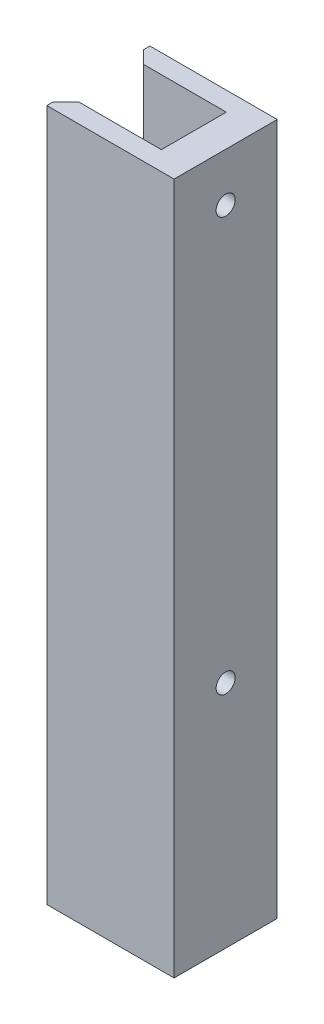
ISO-10303-21;
HEADER;
FILE_DESCRIPTION(('STEP AP214'),'2;1');
FILE_NAME('part.step','',(''),(''),'','','');
FILE_SCHEMA(('AUTOMOTIVE_DESIGN { 1 0 10303 214 1 1 1 1 }'));
ENDSEC;
DATA;
#1=APPLICATION_CONTEXT('core data for automotive mechanical design processes');
#2=APPLICATION_PROTOCOL_DEFINITION('international standard','automotive_design',2000,#1);
#3=PRODUCT_CONTEXT('',#1,'mechanical');
#4=PRODUCT('Part','Part','',(#3));
#5=PRODUCT_RELATED_PRODUCT_CATEGORY('part','',(#4));
#6=PRODUCT_DEFINITION_FORMATION('','',#4);
#7=PRODUCT_DEFINITION_CONTEXT('part definition',#1,'design');
#8=PRODUCT_DEFINITION('design','',#6,#7);
#9=PRODUCT_DEFINITION_SHAPE('','',#8);
#10=(LENGTH_UNIT() NAMED_UNIT(*) SI_UNIT(.MILLI.,.METRE.));
#11=(NAMED_UNIT(*) PLANE_ANGLE_UNIT() SI_UNIT($,.RADIAN.));
#12=(NAMED_UNIT(*) SI_UNIT($,.STERADIAN.) SOLID_ANGLE_UNIT());
#13=UNCERTAINTY_MEASURE_WITH_UNIT(LENGTH_MEASURE(1.E-05),#10,'distance_accuracy_value','');
#14=(GEOMETRIC_REPRESENTATION_CONTEXT(3) GLOBAL_UNCERTAINTY_ASSIGNED_CONTEXT((#13)) GLOBAL_UNIT_ASSIGNED_CONTEXT((#10,
#11,#12)) REPRESENTATION_CONTEXT('',''));
#15=CARTESIAN_POINT('',(0.,0.,0.));
#16=DIRECTION('',(0.,0.,1.));
#17=DIRECTION('',(1.,0.,0.));
#18=AXIS2_PLACEMENT_3D('',#15,#16,#17);
#19=CARTESIAN_POINT('',(2.96518887031091,45.5267276110473,0.));
#20=DIRECTION('',(0.,1.,0.));
#21=DIRECTION('',(0.,0.,1.));
#22=AXIS2_PLACEMENT_3D('',#19,#20,#21);
#23=PLANE('',#22);
#24=DIRECTION('',(0.,0.,-1.));
#25=VECTOR('',#24,1.);
#26=CARTESIAN_POINT('',(-17.0348111296891,45.5267276110473,0.));
#27=LINE('',#26,#25);
#28=CARTESIAN_POINT('',(-17.0348111296891,45.5267276110474,123.9));
#29=VERTEX_POINT('',#28);
#30=CARTESIAN_POINT('',(-17.0348111296891,45.5267276110474,122.9));
#31=VERTEX_POINT('',#30);
#32=EDGE_CURVE('E158',#29,#31,#27,.T.);
#33=ORIENTED_EDGE('',*,*,#32,.F.);
#34=DIRECTION('',(0.707106781186545,0.,0.70710678118655));
#35=VECTOR('',#34,1.);
#36=CARTESIAN_POINT('',(-68.9848111296891,45.5267276110473,71.9499999999995));
#37=LINE('',#36,#35);
#38=CARTESIAN_POINT('',(-15.0348111296891,45.5267276110474,125.9));
#39=VERTEX_POINT('',#38);
#40=EDGE_CURVE('E210',#29,#39,#37,.T.);
#41=ORIENTED_EDGE('',*,*,#40,.T.);
#42=DIRECTION('',(1.,0.,0.));
#43=VECTOR('',#42,1.);
#44=CARTESIAN_POINT('',(0.,45.5267276110474,125.9));
#45=LINE('',#44,#43);
#46=CARTESIAN_POINT('',(-2.03481112968909,45.5267276110474,125.9));
#47=VERTEX_POINT('',#46);
#48=EDGE_CURVE('E151',#39,#47,#45,.T.);
#49=ORIENTED_EDGE('',*,*,#48,.T.);
#50=DIRECTION('',(0.,0.,-1.));
#51=VECTOR('',#50,1.);
#52=CARTESIAN_POINT('',(-2.03481112968909,45.5267276110473,0.));
#53=LINE('',#52,#51);
#54=CARTESIAN_POINT('',(-2.03481112968909,45.5267276110474,136.1));
#55=VERTEX_POINT('',#54);
#56=EDGE_CURVE('E168',#55,#47,#53,.T.);
#57=ORIENTED_EDGE('',*,*,#56,.F.);
#58=DIRECTION('',(-1.,0.,0.));
#59=VECTOR('',#58,1.);
#60=CARTESIAN_POINT('',(0.,45.5267276110474,136.1));
#61=LINE('',#60,#59);
#62=CARTESIAN_POINT('',(-15.0348111296891,45.5267276110474,136.1));
#63=VERTEX_POINT('',#62);
#64=EDGE_CURVE('E169',#55,#63,#61,.T.);
#65=ORIENTED_EDGE('',*,*,#64,.T.);
#66=DIRECTION('',(-0.707106781186543,0.,0.707106781186552));
#67=VECTOR('',#66,1.);
#68=CARTESIAN_POINT('',(62.0151888703108,45.5267276110473,59.0499999999991));
#69=LINE('',#68,#67);
#70=CARTESIAN_POINT('',(-17.0348111296891,45.5267276110474,138.1));
#71=VERTEX_POINT('',#70);
#72=EDGE_CURVE('E57',#63,#71,#69,.T.);
#73=ORIENTED_EDGE('',*,*,#72,.T.);
#74=DIRECTION('',(0.,0.,-1.));
#75=VECTOR('',#74,1.);
#76=CARTESIAN_POINT('',(-17.0348111296891,45.5267276110473,0.));
#77=LINE('',#76,#75);
#78=CARTESIAN_POINT('',(-17.0348111296891,45.5267276110474,139.1));
#79=VERTEX_POINT('',#78);
#80=EDGE_CURVE('E129',#79,#71,#77,.T.);
#81=ORIENTED_EDGE('',*,*,#80,.F.);
#82=DIRECTION('',(1.,0.,0.));
#83=VECTOR('',#82,1.);
#84=CARTESIAN_POINT('',(0.,45.5267276110474,139.1));
#85=LINE('',#84,#83);
#86=CARTESIAN_POINT('',(2.96518887031091,45.5267276110474,139.1));
#87=VERTEX_POINT('',#86);
#88=EDGE_CURVE('E126',#79,#87,#85,.T.);
#89=ORIENTED_EDGE('',*,*,#88,.T.);
#90=DIRECTION('',(0.,0.,-1.));
#91=VECTOR('',#90,1.);
#92=CARTESIAN_POINT('',(2.96518887031091,45.5267276110473,0.));
#93=LINE('',#92,#91);
#94=CARTESIAN_POINT('',(2.96518887031091,45.5267276110474,122.9));
#95=VERTEX_POINT('',#94);
#96=EDGE_CURVE('E173',#87,#95,#93,.T.);
#97=ORIENTED_EDGE('',*,*,#96,.T.);
#98=DIRECTION('',(1.,0.,0.));
#99=VECTOR('',#98,1.);
#100=CARTESIAN_POINT('',(0.,45.5267276110474,122.9));
#101=LINE('',#100,#99);
#102=EDGE_CURVE('E161',#31,#95,#101,.T.);
#103=ORIENTED_EDGE('',*,*,#102,.F.);
#104=EDGE_LOOP('',(#33,#41,#49,#57,#65,#73,#81,#89,#97,#103));
#105=FACE_BOUND('',#104,.T.);
#106=ADVANCED_FACE('F41',(#105),#23,.T.);
#107=CARTESIAN_POINT('',(2.96518887031091,-27.0732723889526,131.));
#108=DIRECTION('',(-1.,0.,0.));
#109=DIRECTION('',(0.,0.,1.));
#110=AXIS2_PLACEMENT_3D('',#107,#108,#109);
#111=CYLINDRICAL_SURFACE('',#110,1.5);
#112=CARTESIAN_POINT('',(2.96518887031091,-27.0732723889526,131.));
#113=DIRECTION('',(1.,0.,0.));
#114=DIRECTION('',(0.,0.,-1.));
#115=AXIS2_PLACEMENT_3D('',#112,#113,#114);
#116=CIRCLE('',#115,1.5);
#117=CARTESIAN_POINT('',(2.96518887031091,-27.0732723889526,129.5));
#118=VERTEX_POINT('',#117);
#119=EDGE_CURVE('E175',#118,#118,#116,.T.);
#120=ORIENTED_EDGE('',*,*,#119,.T.);
#121=EDGE_LOOP('',(#120));
#122=FACE_BOUND('',#121,.T.);
#123=CARTESIAN_POINT('',(-2.03481112968909,-27.0732723889526,131.));
#124=DIRECTION('',(1.,0.,0.));
#125=DIRECTION('',(0.,0.,-1.));
#126=AXIS2_PLACEMENT_3D('',#123,#124,#125);
#127=CIRCLE('',#126,1.5);
#128=CARTESIAN_POINT('',(-2.03481112968909,-27.0732723889526,129.5));
#129=VERTEX_POINT('',#128);
#130=EDGE_CURVE('E194',#129,#129,#127,.T.);
#131=ORIENTED_EDGE('',*,*,#130,.F.);
#132=EDGE_LOOP('',(#131));
#133=FACE_BOUND('',#132,.T.);
#134=ADVANCED_FACE('F240',(#122,#133),#111,.F.);
#135=CARTESIAN_POINT('',(2.96518887031091,37.9267276110474,131.));
#136=DIRECTION('',(-1.,0.,0.));
#137=DIRECTION('',(0.,0.,1.));
#138=AXIS2_PLACEMENT_3D('',#135,#136,#137);
#139=CYLINDRICAL_SURFACE('',#138,1.5);
#140=CARTESIAN_POINT('',(2.96518887031091,37.9267276110474,131.));
#141=DIRECTION('',(1.,0.,0.));
#142=DIRECTION('',(0.,0.,-1.));
#143=AXIS2_PLACEMENT_3D('',#140,#141,#142);
#144=CIRCLE('',#143,1.5);
#145=CARTESIAN_POINT('',(2.96518887031091,37.9267276110474,129.5));
#146=VERTEX_POINT('',#145);
#147=EDGE_CURVE('E179',#146,#146,#144,.T.);
#148=ORIENTED_EDGE('',*,*,#147,.T.);
#149=EDGE_LOOP('',(#148));
#150=FACE_BOUND('',#149,.T.);
#151=CARTESIAN_POINT('',(-2.03481112968909,37.9267276110474,131.));
#152=DIRECTION('',(1.,0.,0.));
#153=DIRECTION('',(0.,0.,-1.));
#154=AXIS2_PLACEMENT_3D('',#151,#152,#153);
#155=CIRCLE('',#154,1.5);
#156=CARTESIAN_POINT('',(-2.03481112968909,37.9267276110474,129.5));
#157=VERTEX_POINT('',#156);
#158=EDGE_CURVE('E176',#157,#157,#155,.T.);
#159=ORIENTED_EDGE('',*,*,#158,.F.);
#160=EDGE_LOOP('',(#159));
#161=FACE_BOUND('',#160,.T.);
#162=ADVANCED_FACE('F247',(#150,#161),#139,.F.);
#163=CARTESIAN_POINT('',(2.96518887031091,0.,0.));
#164=DIRECTION('',(1.,0.,0.));
#165=DIRECTION('',(0.,0.,-1.));
#166=AXIS2_PLACEMENT_3D('',#163,#164,#165);
#167=PLANE('',#166);
#168=ORIENTED_EDGE('',*,*,#96,.F.);
#169=DIRECTION('',(0.,-1.,0.));
#170=VECTOR('',#169,1.);
#171=CARTESIAN_POINT('',(2.96518887031091,65.7504760272041,139.1));
#172=LINE('',#171,#170);
#173=CARTESIAN_POINT('',(2.96518887031091,-63.1732723889526,139.1));
#174=VERTEX_POINT('',#173);
#175=EDGE_CURVE('E128',#87,#174,#172,.T.);
#176=ORIENTED_EDGE('',*,*,#175,.T.);
#177=DIRECTION('',(0.,0.,1.));
#178=VECTOR('',#177,1.);
#179=CARTESIAN_POINT('',(2.96518887031091,-63.1732723889527,0.));
#180=LINE('',#179,#178);
#181=CARTESIAN_POINT('',(2.96518887031091,-63.1732723889527,122.9));
#182=VERTEX_POINT('',#181);
#183=EDGE_CURVE('E144',#182,#174,#180,.T.);
#184=ORIENTED_EDGE('',*,*,#183,.F.);
#185=DIRECTION('',(0.,-1.,0.));
#186=VECTOR('',#185,1.);
#187=CARTESIAN_POINT('',(2.96518887031091,65.750476027204,122.9));
#188=LINE('',#187,#186);
#189=EDGE_CURVE('E157',#95,#182,#188,.T.);
#190=ORIENTED_EDGE('',*,*,#189,.F.);
#191=EDGE_LOOP('',(#168,#176,#184,#190));
#192=FACE_BOUND('',#191,.T.);
#193=ORIENTED_EDGE('',*,*,#119,.F.);
#194=EDGE_LOOP('',(#193));
#195=FACE_BOUND('',#194,.T.);
#196=ORIENTED_EDGE('',*,*,#147,.F.);
#197=EDGE_LOOP('',(#196));
#198=FACE_BOUND('',#197,.T.);
#199=ADVANCED_FACE('F257',(#192,#195,#198),#167,.T.);
#200=CARTESIAN_POINT('',(-2.03481112968909,0.,0.));
#201=DIRECTION('',(1.,0.,0.));
#202=DIRECTION('',(0.,0.,-1.));
#203=AXIS2_PLACEMENT_3D('',#200,#201,#202);
#204=PLANE('',#203);
#205=ORIENTED_EDGE('',*,*,#56,.T.);
#206=DIRECTION('',(0.,1.,0.));
#207=VECTOR('',#206,1.);
#208=CARTESIAN_POINT('',(-2.03481112968909,0.,125.9));
#209=LINE('',#208,#207);
#210=CARTESIAN_POINT('',(-2.03481112968909,-60.1732723889526,125.9));
#211=VERTEX_POINT('',#210);
#212=EDGE_CURVE('E191',#211,#47,#209,.T.);
#213=ORIENTED_EDGE('',*,*,#212,.F.);
#214=DIRECTION('',(0.,0.,-1.));
#215=VECTOR('',#214,1.);
#216=CARTESIAN_POINT('',(-2.03481112968909,-60.1732723889527,0.));
#217=LINE('',#216,#215);
#218=CARTESIAN_POINT('',(-2.03481112968909,-60.1732723889526,136.1));
#219=VERTEX_POINT('',#218);
#220=EDGE_CURVE('E188',#219,#211,#217,.T.);
#221=ORIENTED_EDGE('',*,*,#220,.F.);
#222=DIRECTION('',(0.,-1.,0.));
#223=VECTOR('',#222,1.);
#224=CARTESIAN_POINT('',(-2.03481112968909,0.,136.1));
#225=LINE('',#224,#223);
#226=EDGE_CURVE('E185',#55,#219,#225,.T.);
#227=ORIENTED_EDGE('',*,*,#226,.F.);
#228=EDGE_LOOP('',(#205,#213,#221,#227));
#229=FACE_BOUND('',#228,.T.);
#230=ORIENTED_EDGE('',*,*,#130,.T.);
#231=EDGE_LOOP('',(#230));
#232=FACE_BOUND('',#231,.T.);
#233=ORIENTED_EDGE('',*,*,#158,.T.);
#234=EDGE_LOOP('',(#233));
#235=FACE_BOUND('',#234,.T.);
#236=ADVANCED_FACE('F229',(#229,#232,#235),#204,.F.);
#237=CARTESIAN_POINT('',(0.,65.7504760272041,136.1));
#238=DIRECTION('',(0.,0.,1.));
#239=DIRECTION('',(0.,-1.,0.));
#240=AXIS2_PLACEMENT_3D('',#237,#238,#239);
#241=PLANE('',#240);
#242=DIRECTION('',(-1.,0.,0.));
#243=VECTOR('',#242,1.);
#244=CARTESIAN_POINT('',(0.,-60.1732723889526,136.1));
#245=LINE('',#244,#243);
#246=CARTESIAN_POINT('',(-15.0348111296891,-60.1732723889526,136.1));
#247=VERTEX_POINT('',#246);
#248=EDGE_CURVE('E156',#219,#247,#245,.T.);
#249=ORIENTED_EDGE('',*,*,#248,.T.);
#250=DIRECTION('',(0.,1.,0.));
#251=VECTOR('',#250,1.);
#252=CARTESIAN_POINT('',(-15.0348111296891,45.5267276110474,136.1));
#253=LINE('',#252,#251);
#254=EDGE_CURVE('E11',#247,#63,#253,.T.);
#255=ORIENTED_EDGE('',*,*,#254,.T.);
#256=ORIENTED_EDGE('',*,*,#64,.F.);
#257=ORIENTED_EDGE('',*,*,#226,.T.);
#258=EDGE_LOOP('',(#249,#255,#256,#257));
#259=FACE_BOUND('',#258,.T.);
#260=ADVANCED_FACE('F231',(#259),#241,.F.);
#261=CARTESIAN_POINT('',(-17.0348111296891,65.750476027204,0.));
#262=DIRECTION('',(-1.,0.,0.));
#263=DIRECTION('',(0.,0.,1.));
#264=AXIS2_PLACEMENT_3D('',#261,#262,#263);
#265=PLANE('',#264);
#266=ORIENTED_EDGE('',*,*,#80,.T.);
#267=DIRECTION('',(0.,-1.,0.));
#268=VECTOR('',#267,1.);
#269=CARTESIAN_POINT('',(-17.0348111296891,-60.1732723889526,138.1));
#270=LINE('',#269,#268);
#271=CARTESIAN_POINT('',(-17.0348111296891,-60.1732723889526,138.1));
#272=VERTEX_POINT('',#271);
#273=EDGE_CURVE('E50',#71,#272,#270,.T.);
#274=ORIENTED_EDGE('',*,*,#273,.T.);
#275=DIRECTION('',(0.,0.,-1.));
#276=VECTOR('',#275,1.);
#277=CARTESIAN_POINT('',(-17.0348111296891,-60.1732723889527,0.));
#278=LINE('',#277,#276);
#279=CARTESIAN_POINT('',(-17.0348111296891,-60.1732723889526,123.9));
#280=VERTEX_POINT('',#279);
#281=EDGE_CURVE('E145',#272,#280,#278,.T.);
#282=ORIENTED_EDGE('',*,*,#281,.T.);
#283=DIRECTION('',(0.,1.,0.));
#284=VECTOR('',#283,1.);
#285=CARTESIAN_POINT('',(-17.0348111296891,45.5267276110474,123.9));
#286=LINE('',#285,#284);
#287=EDGE_CURVE('E207',#280,#29,#286,.T.);
#288=ORIENTED_EDGE('',*,*,#287,.T.);
#289=ORIENTED_EDGE('',*,*,#32,.T.);
#290=DIRECTION('',(0.,-1.,0.));
#291=VECTOR('',#290,1.);
#292=CARTESIAN_POINT('',(-17.0348111296891,65.750476027204,122.9));
#293=LINE('',#292,#291);
#294=CARTESIAN_POINT('',(-17.0348111296891,-63.1732723889527,122.9));
#295=VERTEX_POINT('',#294);
#296=EDGE_CURVE('E135',#31,#295,#293,.T.);
#297=ORIENTED_EDGE('',*,*,#296,.T.);
#298=DIRECTION('',(0.,0.,-1.));
#299=VECTOR('',#298,1.);
#300=CARTESIAN_POINT('',(-17.0348111296891,-63.1732723889527,0.));
#301=LINE('',#300,#299);
#302=CARTESIAN_POINT('',(-17.0348111296891,-63.1732723889526,139.1));
#303=VERTEX_POINT('',#302);
#304=EDGE_CURVE('E132',#303,#295,#301,.T.);
#305=ORIENTED_EDGE('',*,*,#304,.F.);
#306=DIRECTION('',(0.,-1.,0.));
#307=VECTOR('',#306,1.);
#308=CARTESIAN_POINT('',(-17.0348111296891,65.7504760272041,139.1));
#309=LINE('',#308,#307);
#310=EDGE_CURVE('E119',#79,#303,#309,.T.);
#311=ORIENTED_EDGE('',*,*,#310,.F.);
#312=EDGE_LOOP('',(#266,#274,#282,#288,#289,#297,#305,#311));
#313=FACE_BOUND('',#312,.T.);
#314=ADVANCED_FACE('F133',(#313),#265,.T.);
#315=CARTESIAN_POINT('',(0.,65.7504760272041,139.1));
#316=DIRECTION('',(0.,0.,-1.));
#317=DIRECTION('',(0.,1.,0.));
#318=AXIS2_PLACEMENT_3D('',#315,#316,#317);
#319=PLANE('',#318);
#320=ORIENTED_EDGE('',*,*,#88,.F.);
#321=ORIENTED_EDGE('',*,*,#310,.T.);
#322=DIRECTION('',(-1.,0.,0.));
#323=VECTOR('',#322,1.);
#324=CARTESIAN_POINT('',(0.,-63.1732723889526,139.1));
#325=LINE('',#324,#323);
#326=EDGE_CURVE('E124',#174,#303,#325,.T.);
#327=ORIENTED_EDGE('',*,*,#326,.F.);
#328=ORIENTED_EDGE('',*,*,#175,.F.);
#329=EDGE_LOOP('',(#320,#321,#327,#328));
#330=FACE_BOUND('',#329,.T.);
#331=ADVANCED_FACE('F121',(#330),#319,.F.);
#332=CARTESIAN_POINT('',(0.,65.750476027204,125.9));
#333=DIRECTION('',(0.,0.,-1.));
#334=DIRECTION('',(0.,1.,0.));
#335=AXIS2_PLACEMENT_3D('',#332,#333,#334);
#336=PLANE('',#335);
#337=ORIENTED_EDGE('',*,*,#48,.F.);
#338=DIRECTION('',(0.,-1.,0.));
#339=VECTOR('',#338,1.);
#340=CARTESIAN_POINT('',(-15.0348111296891,-60.1732723889526,125.9));
#341=LINE('',#340,#339);
#342=CARTESIAN_POINT('',(-15.0348111296891,-60.1732723889526,125.9));
#343=VERTEX_POINT('',#342);
#344=EDGE_CURVE('E182',#39,#343,#341,.T.);
#345=ORIENTED_EDGE('',*,*,#344,.T.);
#346=DIRECTION('',(1.,0.,0.));
#347=VECTOR('',#346,1.);
#348=CARTESIAN_POINT('',(0.,-60.1732723889526,125.9));
#349=LINE('',#348,#347);
#350=EDGE_CURVE('E153',#343,#211,#349,.T.);
#351=ORIENTED_EDGE('',*,*,#350,.T.);
#352=ORIENTED_EDGE('',*,*,#212,.T.);
#353=EDGE_LOOP('',(#337,#345,#351,#352));
#354=FACE_BOUND('',#353,.T.);
#355=ADVANCED_FACE('F225',(#354),#336,.F.);
#356=CARTESIAN_POINT('',(0.,65.750476027204,122.9));
#357=DIRECTION('',(0.,0.,-1.));
#358=DIRECTION('',(0.,1.,0.));
#359=AXIS2_PLACEMENT_3D('',#356,#357,#358);
#360=PLANE('',#359);
#361=ORIENTED_EDGE('',*,*,#296,.F.);
#362=ORIENTED_EDGE('',*,*,#102,.T.);
#363=ORIENTED_EDGE('',*,*,#189,.T.);
#364=DIRECTION('',(1.,0.,0.));
#365=VECTOR('',#364,1.);
#366=CARTESIAN_POINT('',(0.,-63.1732723889527,122.9));
#367=LINE('',#366,#365);
#368=EDGE_CURVE('E139',#295,#182,#367,.T.);
#369=ORIENTED_EDGE('',*,*,#368,.F.);
#370=EDGE_LOOP('',(#361,#362,#363,#369));
#371=FACE_BOUND('',#370,.T.);
#372=ADVANCED_FACE('F238',(#371),#360,.T.);
#373=CARTESIAN_POINT('',(-15.0348111296891,65.750476027204,125.9));
#374=DIRECTION('',(-0.70710678118655,0.,0.707106781186545));
#375=DIRECTION('',(0.,1.,0.));
#376=AXIS2_PLACEMENT_3D('',#373,#374,#375);
#377=PLANE('',#376);
#378=ORIENTED_EDGE('',*,*,#40,.F.);
#379=ORIENTED_EDGE('',*,*,#287,.F.);
#380=DIRECTION('',(-0.707106781186545,0.,-0.70710678118655));
#381=VECTOR('',#380,1.);
#382=CARTESIAN_POINT('',(-15.0348111296891,-60.1732723889526,125.9));
#383=LINE('',#382,#381);
#384=EDGE_CURVE('E204',#343,#280,#383,.T.);
#385=ORIENTED_EDGE('',*,*,#384,.F.);
#386=ORIENTED_EDGE('',*,*,#344,.F.);
#387=EDGE_LOOP('',(#378,#379,#385,#386));
#388=FACE_BOUND('',#387,.T.);
#389=ADVANCED_FACE('F222',(#388),#377,.T.);
#390=CARTESIAN_POINT('',(-17.0348111296891,65.7504760272041,138.1));
#391=DIRECTION('',(-0.707106781186552,0.,-0.707106781186543));
#392=DIRECTION('',(0.,1.,0.));
#393=AXIS2_PLACEMENT_3D('',#390,#391,#392);
#394=PLANE('',#393);
#395=ORIENTED_EDGE('',*,*,#72,.F.);
#396=ORIENTED_EDGE('',*,*,#254,.F.);
#397=DIRECTION('',(0.707106781186543,0.,-0.707106781186552));
#398=VECTOR('',#397,1.);
#399=CARTESIAN_POINT('',(-17.0348111296891,-60.1732723889526,138.1));
#400=LINE('',#399,#398);
#401=EDGE_CURVE('E201',#272,#247,#400,.T.);
#402=ORIENTED_EDGE('',*,*,#401,.F.);
#403=ORIENTED_EDGE('',*,*,#273,.F.);
#404=EDGE_LOOP('',(#395,#396,#402,#403));
#405=FACE_BOUND('',#404,.T.);
#406=ADVANCED_FACE('F44',(#405),#394,.T.);
#407=CARTESIAN_POINT('',(0.,-60.1732723889527,0.));
#408=DIRECTION('',(0.,-1.,0.));
#409=DIRECTION('',(0.,0.,-1.));
#410=AXIS2_PLACEMENT_3D('',#407,#408,#409);
#411=PLANE('',#410);
#412=ORIENTED_EDGE('',*,*,#350,.F.);
#413=ORIENTED_EDGE('',*,*,#384,.T.);
#414=ORIENTED_EDGE('',*,*,#281,.F.);
#415=ORIENTED_EDGE('',*,*,#401,.T.);
#416=ORIENTED_EDGE('',*,*,#248,.F.);
#417=ORIENTED_EDGE('',*,*,#220,.T.);
#418=EDGE_LOOP('',(#412,#413,#414,#415,#416,#417));
#419=FACE_BOUND('',#418,.T.);
#420=ADVANCED_FACE('F217',(#419),#411,.F.);
#421=CARTESIAN_POINT('',(0.,-63.1732723889527,0.));
#422=DIRECTION('',(0.,-1.,0.));
#423=DIRECTION('',(0.,0.,-1.));
#424=AXIS2_PLACEMENT_3D('',#421,#422,#423);
#425=PLANE('',#424);
#426=ORIENTED_EDGE('',*,*,#326,.T.);
#427=ORIENTED_EDGE('',*,*,#304,.T.);
#428=ORIENTED_EDGE('',*,*,#368,.T.);
#429=ORIENTED_EDGE('',*,*,#183,.T.);
#430=EDGE_LOOP('',(#426,#427,#428,#429));
#431=FACE_BOUND('',#430,.T.);
#432=ADVANCED_FACE('F142',(#431),#425,.T.);
#433=CLOSED_SHELL('',(#106,#134,#162,#199,#236,#260,#314,#331,#355,#372,#389,#406,#420,#432));
#434=MANIFOLD_SOLID_BREP('B2',#433);
#435=ADVANCED_BREP_SHAPE_REPRESENTATION('',(#18,#434),#14);
#436=SHAPE_DEFINITION_REPRESENTATION(#9,#435);
ENDSEC;
END-ISO-10303-21;
